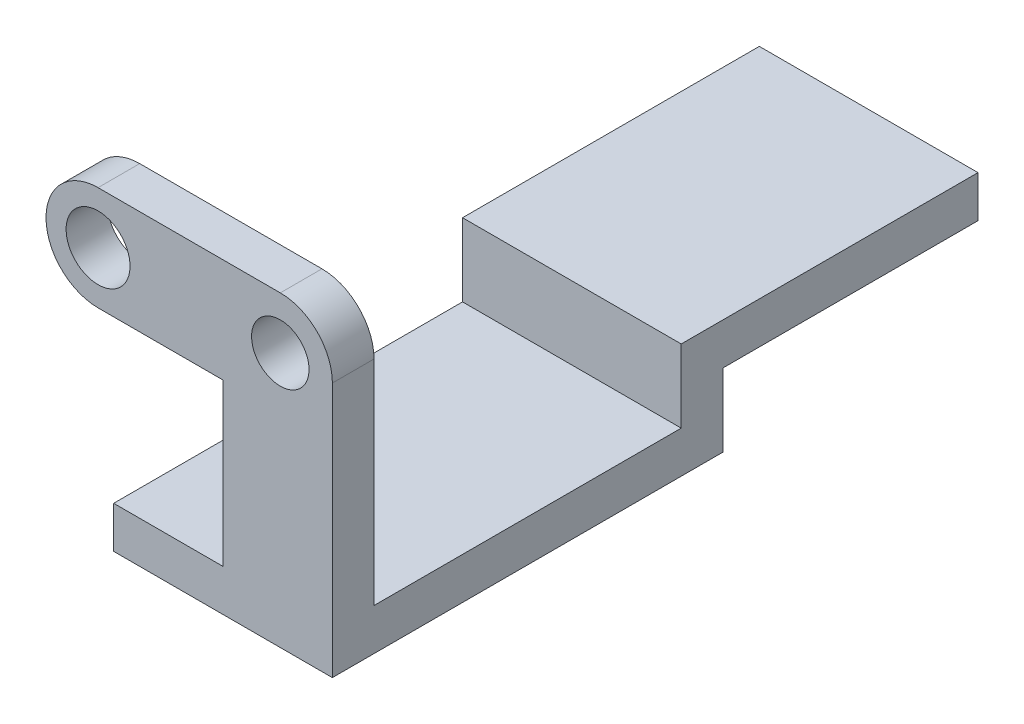
ISO-10303-21;
HEADER;
FILE_DESCRIPTION(('STEP AP214'),'2;1');
FILE_NAME('part.step','',(''),(''),'','','');
FILE_SCHEMA(('AUTOMOTIVE_DESIGN { 1 0 10303 214 1 1 1 1 }'));
ENDSEC;
DATA;
#1=APPLICATION_CONTEXT('core data for automotive mechanical design processes');
#2=APPLICATION_PROTOCOL_DEFINITION('international standard','automotive_design',2000,#1);
#3=PRODUCT_CONTEXT('',#1,'mechanical');
#4=PRODUCT('Part','Part','',(#3));
#5=PRODUCT_RELATED_PRODUCT_CATEGORY('part','',(#4));
#6=PRODUCT_DEFINITION_FORMATION('','',#4);
#7=PRODUCT_DEFINITION_CONTEXT('part definition',#1,'design');
#8=PRODUCT_DEFINITION('design','',#6,#7);
#9=PRODUCT_DEFINITION_SHAPE('','',#8);
#10=(LENGTH_UNIT() NAMED_UNIT(*) SI_UNIT(.MILLI.,.METRE.));
#11=(NAMED_UNIT(*) PLANE_ANGLE_UNIT() SI_UNIT($,.RADIAN.));
#12=(NAMED_UNIT(*) SI_UNIT($,.STERADIAN.) SOLID_ANGLE_UNIT());
#13=UNCERTAINTY_MEASURE_WITH_UNIT(LENGTH_MEASURE(1.E-05),#10,'distance_accuracy_value','');
#14=(GEOMETRIC_REPRESENTATION_CONTEXT(3) GLOBAL_UNCERTAINTY_ASSIGNED_CONTEXT((#13)) GLOBAL_UNIT_ASSIGNED_CONTEXT((#10,
#11,#12)) REPRESENTATION_CONTEXT('',''));
#15=CARTESIAN_POINT('',(0.,0.,0.));
#16=DIRECTION('',(0.,0.,1.));
#17=DIRECTION('',(1.,0.,0.));
#18=AXIS2_PLACEMENT_3D('',#15,#16,#17);
#19=CARTESIAN_POINT('',(42.,0.,0.));
#20=DIRECTION('',(0.,0.,1.));
#21=DIRECTION('',(1.,0.,0.));
#22=AXIS2_PLACEMENT_3D('',#19,#20,#21);
#23=PLANE('',#22);
#24=DIRECTION('',(0.,1.,0.));
#25=VECTOR('',#24,1.);
#26=CARTESIAN_POINT('',(-42.,0.,0.));
#27=LINE('',#26,#25);
#28=CARTESIAN_POINT('',(-42.,0.,0.));
#29=VERTEX_POINT('',#28);
#30=CARTESIAN_POINT('',(-42.,28.,0.));
#31=VERTEX_POINT('',#30);
#32=EDGE_CURVE('E149',#29,#31,#27,.T.);
#33=ORIENTED_EDGE('',*,*,#32,.T.);
#34=DIRECTION('',(-1.,0.,0.));
#35=VECTOR('',#34,1.);
#36=CARTESIAN_POINT('',(42.,28.,0.));
#37=LINE('',#36,#35);
#38=CARTESIAN_POINT('',(42.,28.,0.));
#39=VERTEX_POINT('',#38);
#40=EDGE_CURVE('E11',#39,#31,#37,.T.);
#41=ORIENTED_EDGE('',*,*,#40,.F.);
#42=DIRECTION('',(0.,1.,0.));
#43=VECTOR('',#42,1.);
#44=CARTESIAN_POINT('',(42.,0.,0.));
#45=LINE('',#44,#43);
#46=CARTESIAN_POINT('',(42.,0.,0.));
#47=VERTEX_POINT('',#46);
#48=EDGE_CURVE('E164',#47,#39,#45,.T.);
#49=ORIENTED_EDGE('',*,*,#48,.F.);
#50=DIRECTION('',(-1.,0.,0.));
#51=VECTOR('',#50,1.);
#52=CARTESIAN_POINT('',(42.,0.,0.));
#53=LINE('',#52,#51);
#54=EDGE_CURVE('E148',#47,#29,#53,.T.);
#55=ORIENTED_EDGE('',*,*,#54,.T.);
#56=EDGE_LOOP('',(#33,#41,#49,#55));
#57=FACE_BOUND('',#56,.T.);
#58=ADVANCED_FACE('F39',(#57),#23,.F.);
#59=CARTESIAN_POINT('',(42.,28.,0.));
#60=DIRECTION('',(0.,1.,0.));
#61=DIRECTION('',(0.,0.,1.));
#62=AXIS2_PLACEMENT_3D('',#59,#60,#61);
#63=PLANE('',#62);
#64=DIRECTION('',(0.,0.,-1.));
#65=VECTOR('',#64,1.);
#66=CARTESIAN_POINT('',(-42.,28.,0.));
#67=LINE('',#66,#65);
#68=CARTESIAN_POINT('',(-42.,28.,-98.));
#69=VERTEX_POINT('',#68);
#70=EDGE_CURVE('E152',#31,#69,#67,.T.);
#71=ORIENTED_EDGE('',*,*,#70,.T.);
#72=DIRECTION('',(-1.,0.,0.));
#73=VECTOR('',#72,1.);
#74=CARTESIAN_POINT('',(42.,28.,-98.));
#75=LINE('',#74,#73);
#76=CARTESIAN_POINT('',(42.,28.,-98.));
#77=VERTEX_POINT('',#76);
#78=EDGE_CURVE('E48',#77,#69,#75,.T.);
#79=ORIENTED_EDGE('',*,*,#78,.F.);
#80=DIRECTION('',(0.,0.,-1.));
#81=VECTOR('',#80,1.);
#82=CARTESIAN_POINT('',(42.,28.,0.));
#83=LINE('',#82,#81);
#84=EDGE_CURVE('E100',#39,#77,#83,.T.);
#85=ORIENTED_EDGE('',*,*,#84,.F.);
#86=ORIENTED_EDGE('',*,*,#40,.T.);
#87=EDGE_LOOP('',(#71,#79,#85,#86));
#88=FACE_BOUND('',#87,.T.);
#89=ADVANCED_FACE('F316',(#88),#63,.F.);
#90=CARTESIAN_POINT('',(42.,28.,-98.));
#91=DIRECTION('',(0.,0.,1.));
#92=DIRECTION('',(1.,0.,0.));
#93=AXIS2_PLACEMENT_3D('',#90,#91,#92);
#94=PLANE('',#93);
#95=DIRECTION('',(0.,1.,0.));
#96=VECTOR('',#95,1.);
#97=CARTESIAN_POINT('',(-42.,28.,-98.));
#98=LINE('',#97,#96);
#99=CARTESIAN_POINT('',(-42.,44.,-98.));
#100=VERTEX_POINT('',#99);
#101=EDGE_CURVE('E155',#69,#100,#98,.T.);
#102=ORIENTED_EDGE('',*,*,#101,.T.);
#103=DIRECTION('',(-1.,0.,0.));
#104=VECTOR('',#103,1.);
#105=CARTESIAN_POINT('',(42.,44.,-98.));
#106=LINE('',#105,#104);
#107=CARTESIAN_POINT('',(42.,44.,-98.));
#108=VERTEX_POINT('',#107);
#109=EDGE_CURVE('E170',#108,#100,#106,.T.);
#110=ORIENTED_EDGE('',*,*,#109,.F.);
#111=DIRECTION('',(0.,1.,0.));
#112=VECTOR('',#111,1.);
#113=CARTESIAN_POINT('',(42.,28.,-98.));
#114=LINE('',#113,#112);
#115=EDGE_CURVE('E241',#77,#108,#114,.T.);
#116=ORIENTED_EDGE('',*,*,#115,.F.);
#117=ORIENTED_EDGE('',*,*,#78,.T.);
#118=EDGE_LOOP('',(#102,#110,#116,#117));
#119=FACE_BOUND('',#118,.T.);
#120=ADVANCED_FACE('F245',(#119),#94,.F.);
#121=CARTESIAN_POINT('',(42.,44.,-98.));
#122=DIRECTION('',(0.,-1.,0.));
#123=DIRECTION('',(0.,0.,-1.));
#124=AXIS2_PLACEMENT_3D('',#121,#122,#123);
#125=PLANE('',#124);
#126=DIRECTION('',(0.,0.,1.));
#127=VECTOR('',#126,1.);
#128=CARTESIAN_POINT('',(-42.,44.,-98.));
#129=LINE('',#128,#127);
#130=CARTESIAN_POINT('',(-42.,44.,16.));
#131=VERTEX_POINT('',#130);
#132=EDGE_CURVE('E157',#100,#131,#129,.T.);
#133=ORIENTED_EDGE('',*,*,#132,.T.);
#134=DIRECTION('',(-1.,0.,0.));
#135=VECTOR('',#134,1.);
#136=CARTESIAN_POINT('',(42.,44.,16.));
#137=LINE('',#136,#135);
#138=CARTESIAN_POINT('',(42.,44.,16.));
#139=VERTEX_POINT('',#138);
#140=EDGE_CURVE('E134',#139,#131,#137,.T.);
#141=ORIENTED_EDGE('',*,*,#140,.F.);
#142=DIRECTION('',(0.,0.,1.));
#143=VECTOR('',#142,1.);
#144=CARTESIAN_POINT('',(42.,44.,-98.));
#145=LINE('',#144,#143);
#146=EDGE_CURVE('E121',#108,#139,#145,.T.);
#147=ORIENTED_EDGE('',*,*,#146,.F.);
#148=ORIENTED_EDGE('',*,*,#109,.T.);
#149=EDGE_LOOP('',(#133,#141,#147,#148));
#150=FACE_BOUND('',#149,.T.);
#151=ADVANCED_FACE('F249',(#150),#125,.F.);
#152=CARTESIAN_POINT('',(42.,44.,16.));
#153=DIRECTION('',(0.,0.,-1.));
#154=DIRECTION('',(0.,1.,0.));
#155=AXIS2_PLACEMENT_3D('',#152,#153,#154);
#156=PLANE('',#155);
#157=DIRECTION('',(0.,-1.,0.));
#158=VECTOR('',#157,1.);
#159=CARTESIAN_POINT('',(-42.,44.,16.));
#160=LINE('',#159,#158);
#161=CARTESIAN_POINT('',(-42.,16.,16.));
#162=VERTEX_POINT('',#161);
#163=EDGE_CURVE('E130',#131,#162,#160,.T.);
#164=ORIENTED_EDGE('',*,*,#163,.T.);
#165=DIRECTION('',(-1.,0.,0.));
#166=VECTOR('',#165,1.);
#167=CARTESIAN_POINT('',(42.,16.,16.));
#168=LINE('',#167,#166);
#169=CARTESIAN_POINT('',(42.,16.,16.));
#170=VERTEX_POINT('',#169);
#171=EDGE_CURVE('E127',#170,#162,#168,.T.);
#172=ORIENTED_EDGE('',*,*,#171,.F.);
#173=DIRECTION('',(0.,-1.,0.));
#174=VECTOR('',#173,1.);
#175=CARTESIAN_POINT('',(42.,44.,16.));
#176=LINE('',#175,#174);
#177=EDGE_CURVE('E114',#139,#170,#176,.T.);
#178=ORIENTED_EDGE('',*,*,#177,.F.);
#179=ORIENTED_EDGE('',*,*,#140,.T.);
#180=EDGE_LOOP('',(#164,#172,#178,#179));
#181=FACE_BOUND('',#180,.T.);
#182=ADVANCED_FACE('F128',(#181),#156,.F.);
#183=CARTESIAN_POINT('',(42.,16.,16.));
#184=DIRECTION('',(0.,-1.,0.));
#185=DIRECTION('',(0.,0.,-1.));
#186=AXIS2_PLACEMENT_3D('',#183,#184,#185);
#187=PLANE('',#186);
#188=DIRECTION('',(0.,0.,1.));
#189=VECTOR('',#188,1.);
#190=CARTESIAN_POINT('',(0.,16.,0.));
#191=LINE('',#190,#189);
#192=CARTESIAN_POINT('',(0.,16.,134.));
#193=VERTEX_POINT('',#192);
#194=CARTESIAN_POINT('',(0.,16.,150.));
#195=VERTEX_POINT('',#194);
#196=EDGE_CURVE('E228',#193,#195,#191,.T.);
#197=ORIENTED_EDGE('',*,*,#196,.F.);
#198=DIRECTION('',(1.,0.,0.));
#199=VECTOR('',#198,1.);
#200=CARTESIAN_POINT('',(0.,16.,134.));
#201=LINE('',#200,#199);
#202=CARTESIAN_POINT('',(42.,16.,134.));
#203=VERTEX_POINT('',#202);
#204=EDGE_CURVE('E141',#193,#203,#201,.T.);
#205=ORIENTED_EDGE('',*,*,#204,.T.);
#206=DIRECTION('',(0.,0.,1.));
#207=VECTOR('',#206,1.);
#208=CARTESIAN_POINT('',(42.,16.,16.));
#209=LINE('',#208,#207);
#210=EDGE_CURVE('E119',#170,#203,#209,.T.);
#211=ORIENTED_EDGE('',*,*,#210,.F.);
#212=ORIENTED_EDGE('',*,*,#171,.T.);
#213=DIRECTION('',(0.,0.,1.));
#214=VECTOR('',#213,1.);
#215=CARTESIAN_POINT('',(-42.,16.,16.));
#216=LINE('',#215,#214);
#217=CARTESIAN_POINT('',(-42.,16.,150.));
#218=VERTEX_POINT('',#217);
#219=EDGE_CURVE('E160',#162,#218,#216,.T.);
#220=ORIENTED_EDGE('',*,*,#219,.T.);
#221=DIRECTION('',(-1.,0.,0.));
#222=VECTOR('',#221,1.);
#223=CARTESIAN_POINT('',(42.,16.,150.));
#224=LINE('',#223,#222);
#225=EDGE_CURVE('E135',#195,#218,#224,.T.);
#226=ORIENTED_EDGE('',*,*,#225,.F.);
#227=EDGE_LOOP('',(#197,#205,#211,#212,#220,#226));
#228=FACE_BOUND('',#227,.T.);
#229=ADVANCED_FACE('F139',(#228),#187,.F.);
#230=CARTESIAN_POINT('',(42.,16.,150.));
#231=DIRECTION('',(0.,0.,-1.));
#232=DIRECTION('',(-1.,0.,0.));
#233=AXIS2_PLACEMENT_3D('',#230,#231,#232);
#234=PLANE('',#233);
#235=CARTESIAN_POINT('',(22.,98.,150.));
#236=DIRECTION('',(0.,0.,-1.));
#237=DIRECTION('',(0.,1.,0.));
#238=AXIS2_PLACEMENT_3D('',#235,#236,#237);
#239=CIRCLE('',#238,11.0343371601663);
#240=CARTESIAN_POINT('',(22.,109.034337160166,150.));
#241=VERTEX_POINT('',#240);
#242=EDGE_CURVE('E176',#241,#241,#239,.T.);
#243=ORIENTED_EDGE('',*,*,#242,.T.);
#244=EDGE_LOOP('',(#243));
#245=FACE_BOUND('',#244,.T.);
#246=CARTESIAN_POINT('',(-48.,98.,150.));
#247=DIRECTION('',(0.,0.,-1.));
#248=DIRECTION('',(0.,1.,0.));
#249=AXIS2_PLACEMENT_3D('',#246,#247,#248);
#250=CIRCLE('',#249,12.2801982153419);
#251=CARTESIAN_POINT('',(-48.,110.280198215342,150.));
#252=VERTEX_POINT('',#251);
#253=EDGE_CURVE('E182',#252,#252,#250,.T.);
#254=ORIENTED_EDGE('',*,*,#253,.T.);
#255=EDGE_LOOP('',(#254));
#256=FACE_BOUND('',#255,.T.);
#257=DIRECTION('',(1.,0.,0.));
#258=VECTOR('',#257,1.);
#259=CARTESIAN_POINT('',(0.,78.,150.));
#260=LINE('',#259,#258);
#261=CARTESIAN_POINT('',(-48.,78.,150.));
#262=VERTEX_POINT('',#261);
#263=CARTESIAN_POINT('',(0.,78.,150.));
#264=VERTEX_POINT('',#263);
#265=EDGE_CURVE('E189',#262,#264,#260,.T.);
#266=ORIENTED_EDGE('',*,*,#265,.T.);
#267=DIRECTION('',(0.,-1.,0.));
#268=VECTOR('',#267,1.);
#269=CARTESIAN_POINT('',(0.,98.,150.));
#270=LINE('',#269,#268);
#271=EDGE_CURVE('E234',#264,#195,#270,.T.);
#272=ORIENTED_EDGE('',*,*,#271,.T.);
#273=ORIENTED_EDGE('',*,*,#225,.T.);
#274=DIRECTION('',(0.,-1.,0.));
#275=VECTOR('',#274,1.);
#276=CARTESIAN_POINT('',(-42.,16.,150.));
#277=LINE('',#276,#275);
#278=CARTESIAN_POINT('',(-42.,0.,150.));
#279=VERTEX_POINT('',#278);
#280=EDGE_CURVE('E86',#218,#279,#277,.T.);
#281=ORIENTED_EDGE('',*,*,#280,.T.);
#282=DIRECTION('',(-1.,0.,0.));
#283=VECTOR('',#282,1.);
#284=CARTESIAN_POINT('',(42.,0.,150.));
#285=LINE('',#284,#283);
#286=CARTESIAN_POINT('',(42.,0.,150.));
#287=VERTEX_POINT('',#286);
#288=EDGE_CURVE('E166',#287,#279,#285,.T.);
#289=ORIENTED_EDGE('',*,*,#288,.F.);
#290=DIRECTION('',(0.,-1.,0.));
#291=VECTOR('',#290,1.);
#292=CARTESIAN_POINT('',(42.,16.,150.));
#293=LINE('',#292,#291);
#294=CARTESIAN_POINT('',(42.,98.,150.));
#295=VERTEX_POINT('',#294);
#296=EDGE_CURVE('E142',#295,#287,#293,.T.);
#297=ORIENTED_EDGE('',*,*,#296,.F.);
#298=CARTESIAN_POINT('',(22.,98.,150.));
#299=DIRECTION('',(0.,0.,1.));
#300=DIRECTION('',(1.,0.,0.));
#301=AXIS2_PLACEMENT_3D('',#298,#299,#300);
#302=CIRCLE('',#301,20.);
#303=CARTESIAN_POINT('',(22.,118.,150.));
#304=VERTEX_POINT('',#303);
#305=EDGE_CURVE('E196',#295,#304,#302,.T.);
#306=ORIENTED_EDGE('',*,*,#305,.T.);
#307=DIRECTION('',(1.,0.,0.));
#308=VECTOR('',#307,1.);
#309=CARTESIAN_POINT('',(0.,118.,150.));
#310=LINE('',#309,#308);
#311=CARTESIAN_POINT('',(-48.,118.,150.));
#312=VERTEX_POINT('',#311);
#313=EDGE_CURVE('E197',#312,#304,#310,.T.);
#314=ORIENTED_EDGE('',*,*,#313,.F.);
#315=CARTESIAN_POINT('',(-48.,98.,150.));
#316=DIRECTION('',(0.,0.,1.));
#317=DIRECTION('',(1.,0.,0.));
#318=AXIS2_PLACEMENT_3D('',#315,#316,#317);
#319=CIRCLE('',#318,20.);
#320=EDGE_CURVE('E193',#312,#262,#319,.T.);
#321=ORIENTED_EDGE('',*,*,#320,.T.);
#322=EDGE_LOOP('',(#266,#272,#273,#281,#289,#297,#306,#314,#321));
#323=FACE_BOUND('',#322,.T.);
#324=ADVANCED_FACE('F256',(#245,#256,#323),#234,.F.);
#325=CARTESIAN_POINT('',(42.,0.,150.));
#326=DIRECTION('',(0.,1.,0.));
#327=DIRECTION('',(0.,0.,1.));
#328=AXIS2_PLACEMENT_3D('',#325,#326,#327);
#329=PLANE('',#328);
#330=DIRECTION('',(0.,0.,-1.));
#331=VECTOR('',#330,1.);
#332=CARTESIAN_POINT('',(-42.,0.,150.));
#333=LINE('',#332,#331);
#334=EDGE_CURVE('E92',#279,#29,#333,.T.);
#335=ORIENTED_EDGE('',*,*,#334,.T.);
#336=ORIENTED_EDGE('',*,*,#54,.F.);
#337=DIRECTION('',(0.,0.,-1.));
#338=VECTOR('',#337,1.);
#339=CARTESIAN_POINT('',(42.,0.,150.));
#340=LINE('',#339,#338);
#341=EDGE_CURVE('E57',#287,#47,#340,.T.);
#342=ORIENTED_EDGE('',*,*,#341,.F.);
#343=ORIENTED_EDGE('',*,*,#288,.T.);
#344=EDGE_LOOP('',(#335,#336,#342,#343));
#345=FACE_BOUND('',#344,.T.);
#346=ADVANCED_FACE('F323',(#345),#329,.F.);
#347=CARTESIAN_POINT('',(42.,0.,0.));
#348=DIRECTION('',(-1.,0.,0.));
#349=DIRECTION('',(0.,0.,1.));
#350=AXIS2_PLACEMENT_3D('',#347,#348,#349);
#351=PLANE('',#350);
#352=ORIENTED_EDGE('',*,*,#48,.T.);
#353=ORIENTED_EDGE('',*,*,#84,.T.);
#354=ORIENTED_EDGE('',*,*,#115,.T.);
#355=ORIENTED_EDGE('',*,*,#146,.T.);
#356=ORIENTED_EDGE('',*,*,#177,.T.);
#357=ORIENTED_EDGE('',*,*,#210,.T.);
#358=DIRECTION('',(0.,-1.,0.));
#359=VECTOR('',#358,1.);
#360=CARTESIAN_POINT('',(42.,98.,134.));
#361=LINE('',#360,#359);
#362=CARTESIAN_POINT('',(42.,98.,134.));
#363=VERTEX_POINT('',#362);
#364=EDGE_CURVE('E227',#363,#203,#361,.T.);
#365=ORIENTED_EDGE('',*,*,#364,.F.);
#366=DIRECTION('',(0.,0.,-1.));
#367=VECTOR('',#366,1.);
#368=CARTESIAN_POINT('',(42.,98.,0.));
#369=LINE('',#368,#367);
#370=EDGE_CURVE('E224',#295,#363,#369,.T.);
#371=ORIENTED_EDGE('',*,*,#370,.F.);
#372=ORIENTED_EDGE('',*,*,#296,.T.);
#373=ORIENTED_EDGE('',*,*,#341,.T.);
#374=EDGE_LOOP('',(#352,#353,#354,#355,#356,#357,#365,#371,#372,#373));
#375=FACE_BOUND('',#374,.T.);
#376=ADVANCED_FACE('F116',(#375),#351,.F.);
#377=CARTESIAN_POINT('',(-42.,0.,0.));
#378=DIRECTION('',(-1.,0.,0.));
#379=DIRECTION('',(0.,0.,1.));
#380=AXIS2_PLACEMENT_3D('',#377,#378,#379);
#381=PLANE('',#380);
#382=ORIENTED_EDGE('',*,*,#32,.F.);
#383=ORIENTED_EDGE('',*,*,#334,.F.);
#384=ORIENTED_EDGE('',*,*,#280,.F.);
#385=ORIENTED_EDGE('',*,*,#219,.F.);
#386=ORIENTED_EDGE('',*,*,#163,.F.);
#387=ORIENTED_EDGE('',*,*,#132,.F.);
#388=ORIENTED_EDGE('',*,*,#101,.F.);
#389=ORIENTED_EDGE('',*,*,#70,.F.);
#390=EDGE_LOOP('',(#382,#383,#384,#385,#386,#387,#388,#389));
#391=FACE_BOUND('',#390,.T.);
#392=ADVANCED_FACE('F252',(#391),#381,.T.);
#393=CARTESIAN_POINT('',(0.,98.,134.));
#394=DIRECTION('',(0.,0.,-1.));
#395=DIRECTION('',(0.,1.,0.));
#396=AXIS2_PLACEMENT_3D('',#393,#394,#395);
#397=PLANE('',#396);
#398=CARTESIAN_POINT('',(22.,98.,134.));
#399=DIRECTION('',(0.,0.,-1.));
#400=DIRECTION('',(0.,1.,0.));
#401=AXIS2_PLACEMENT_3D('',#398,#399,#400);
#402=CIRCLE('',#401,11.0343371601663);
#403=CARTESIAN_POINT('',(22.,109.034337160166,134.));
#404=VERTEX_POINT('',#403);
#405=EDGE_CURVE('E42',#404,#404,#402,.T.);
#406=ORIENTED_EDGE('',*,*,#405,.F.);
#407=EDGE_LOOP('',(#406));
#408=FACE_BOUND('',#407,.T.);
#409=CARTESIAN_POINT('',(-48.,98.,134.));
#410=DIRECTION('',(0.,0.,-1.));
#411=DIRECTION('',(0.,1.,0.));
#412=AXIS2_PLACEMENT_3D('',#409,#410,#411);
#413=CIRCLE('',#412,12.2801982153419);
#414=CARTESIAN_POINT('',(-48.,110.280198215342,134.));
#415=VERTEX_POINT('',#414);
#416=EDGE_CURVE('E174',#415,#415,#413,.T.);
#417=ORIENTED_EDGE('',*,*,#416,.F.);
#418=EDGE_LOOP('',(#417));
#419=FACE_BOUND('',#418,.T.);
#420=DIRECTION('',(0.,-1.,0.));
#421=VECTOR('',#420,1.);
#422=CARTESIAN_POINT('',(0.,98.,134.));
#423=LINE('',#422,#421);
#424=CARTESIAN_POINT('',(0.,78.,134.));
#425=VERTEX_POINT('',#424);
#426=EDGE_CURVE('E153',#425,#193,#423,.T.);
#427=ORIENTED_EDGE('',*,*,#426,.F.);
#428=DIRECTION('',(1.,0.,0.));
#429=VECTOR('',#428,1.);
#430=CARTESIAN_POINT('',(0.,78.,134.));
#431=LINE('',#430,#429);
#432=CARTESIAN_POINT('',(-48.,78.,134.));
#433=VERTEX_POINT('',#432);
#434=EDGE_CURVE('E180',#433,#425,#431,.T.);
#435=ORIENTED_EDGE('',*,*,#434,.F.);
#436=CARTESIAN_POINT('',(-48.,98.,134.));
#437=DIRECTION('',(0.,0.,-1.));
#438=DIRECTION('',(0.,1.,0.));
#439=AXIS2_PLACEMENT_3D('',#436,#437,#438);
#440=CIRCLE('',#439,20.);
#441=CARTESIAN_POINT('',(-48.,118.,134.));
#442=VERTEX_POINT('',#441);
#443=EDGE_CURVE('E209',#442,#433,#440,.F.);
#444=ORIENTED_EDGE('',*,*,#443,.F.);
#445=DIRECTION('',(1.,0.,0.));
#446=VECTOR('',#445,1.);
#447=CARTESIAN_POINT('',(0.,118.,134.));
#448=LINE('',#447,#446);
#449=CARTESIAN_POINT('',(22.,118.,134.));
#450=VERTEX_POINT('',#449);
#451=EDGE_CURVE('E192',#442,#450,#448,.T.);
#452=ORIENTED_EDGE('',*,*,#451,.T.);
#453=CARTESIAN_POINT('',(22.,98.,134.));
#454=DIRECTION('',(0.,0.,-1.));
#455=DIRECTION('',(0.,1.,0.));
#456=AXIS2_PLACEMENT_3D('',#453,#454,#455);
#457=CIRCLE('',#456,20.);
#458=EDGE_CURVE('E200',#363,#450,#457,.F.);
#459=ORIENTED_EDGE('',*,*,#458,.F.);
#460=ORIENTED_EDGE('',*,*,#364,.T.);
#461=ORIENTED_EDGE('',*,*,#204,.F.);
#462=EDGE_LOOP('',(#427,#435,#444,#452,#459,#460,#461));
#463=FACE_BOUND('',#462,.T.);
#464=ADVANCED_FACE('F269',(#408,#419,#463),#397,.T.);
#465=CARTESIAN_POINT('',(0.,98.,0.));
#466=DIRECTION('',(1.,0.,0.));
#467=DIRECTION('',(0.,0.,-1.));
#468=AXIS2_PLACEMENT_3D('',#465,#466,#467);
#469=PLANE('',#468);
#470=ORIENTED_EDGE('',*,*,#271,.F.);
#471=DIRECTION('',(0.,0.,1.));
#472=VECTOR('',#471,1.);
#473=CARTESIAN_POINT('',(0.,78.,16.9530008928038));
#474=LINE('',#473,#472);
#475=EDGE_CURVE('E213',#425,#264,#474,.T.);
#476=ORIENTED_EDGE('',*,*,#475,.F.);
#477=ORIENTED_EDGE('',*,*,#426,.T.);
#478=ORIENTED_EDGE('',*,*,#196,.T.);
#479=EDGE_LOOP('',(#470,#476,#477,#478));
#480=FACE_BOUND('',#479,.T.);
#481=ADVANCED_FACE('F262',(#480),#469,.F.);
#482=CARTESIAN_POINT('',(0.,78.,16.9530008928038));
#483=DIRECTION('',(0.,-1.,0.));
#484=DIRECTION('',(0.,0.,-1.));
#485=AXIS2_PLACEMENT_3D('',#482,#483,#484);
#486=PLANE('',#485);
#487=DIRECTION('',(0.,0.,1.));
#488=VECTOR('',#487,1.);
#489=CARTESIAN_POINT('',(-48.,78.,16.9530008928038));
#490=LINE('',#489,#488);
#491=EDGE_CURVE('E212',#433,#262,#490,.T.);
#492=ORIENTED_EDGE('',*,*,#491,.F.);
#493=ORIENTED_EDGE('',*,*,#434,.T.);
#494=ORIENTED_EDGE('',*,*,#475,.T.);
#495=ORIENTED_EDGE('',*,*,#265,.F.);
#496=EDGE_LOOP('',(#492,#493,#494,#495));
#497=FACE_BOUND('',#496,.T.);
#498=ADVANCED_FACE('F292',(#497),#486,.T.);
#499=CARTESIAN_POINT('',(-48.,98.,16.9530008928038));
#500=DIRECTION('',(0.,0.,1.));
#501=DIRECTION('',(1.,0.,0.));
#502=AXIS2_PLACEMENT_3D('',#499,#500,#501);
#503=CYLINDRICAL_SURFACE('',#502,20.);
#504=DIRECTION('',(0.,0.,1.));
#505=VECTOR('',#504,1.);
#506=CARTESIAN_POINT('',(-48.,118.,16.9530008928038));
#507=LINE('',#506,#505);
#508=EDGE_CURVE('E201',#442,#312,#507,.T.);
#509=ORIENTED_EDGE('',*,*,#508,.F.);
#510=ORIENTED_EDGE('',*,*,#443,.T.);
#511=ORIENTED_EDGE('',*,*,#491,.T.);
#512=ORIENTED_EDGE('',*,*,#320,.F.);
#513=EDGE_LOOP('',(#509,#510,#511,#512));
#514=FACE_BOUND('',#513,.T.);
#515=ADVANCED_FACE('F296',(#514),#503,.T.);
#516=CARTESIAN_POINT('',(0.,118.,16.9530008928038));
#517=DIRECTION('',(0.,-1.,0.));
#518=DIRECTION('',(1.,0.,0.));
#519=AXIS2_PLACEMENT_3D('',#516,#517,#518);
#520=PLANE('',#519);
#521=ORIENTED_EDGE('',*,*,#451,.F.);
#522=ORIENTED_EDGE('',*,*,#508,.T.);
#523=ORIENTED_EDGE('',*,*,#313,.T.);
#524=DIRECTION('',(0.,0.,1.));
#525=VECTOR('',#524,1.);
#526=CARTESIAN_POINT('',(22.,118.,16.9530008928038));
#527=LINE('',#526,#525);
#528=EDGE_CURVE('E204',#450,#304,#527,.T.);
#529=ORIENTED_EDGE('',*,*,#528,.F.);
#530=EDGE_LOOP('',(#521,#522,#523,#529));
#531=FACE_BOUND('',#530,.T.);
#532=ADVANCED_FACE('F300',(#531),#520,.F.);
#533=CARTESIAN_POINT('',(22.,98.,16.9530008928038));
#534=DIRECTION('',(0.,0.,1.));
#535=DIRECTION('',(1.,0.,0.));
#536=AXIS2_PLACEMENT_3D('',#533,#534,#535);
#537=CYLINDRICAL_SURFACE('',#536,20.);
#538=ORIENTED_EDGE('',*,*,#370,.T.);
#539=ORIENTED_EDGE('',*,*,#458,.T.);
#540=ORIENTED_EDGE('',*,*,#528,.T.);
#541=ORIENTED_EDGE('',*,*,#305,.F.);
#542=EDGE_LOOP('',(#538,#539,#540,#541));
#543=FACE_BOUND('',#542,.T.);
#544=ADVANCED_FACE('F304',(#543),#537,.T.);
#545=CARTESIAN_POINT('',(-48.,98.,150.));
#546=DIRECTION('',(0.,0.,-1.));
#547=DIRECTION('',(0.,1.,0.));
#548=AXIS2_PLACEMENT_3D('',#545,#546,#547);
#549=CYLINDRICAL_SURFACE('',#548,12.2801982153419);
#550=ORIENTED_EDGE('',*,*,#416,.T.);
#551=EDGE_LOOP('',(#550));
#552=FACE_BOUND('',#551,.T.);
#553=ORIENTED_EDGE('',*,*,#253,.F.);
#554=EDGE_LOOP('',(#553));
#555=FACE_BOUND('',#554,.T.);
#556=ADVANCED_FACE('F306',(#552,#555),#549,.F.);
#557=CARTESIAN_POINT('',(22.,98.,150.));
#558=DIRECTION('',(0.,0.,-1.));
#559=DIRECTION('',(0.,1.,0.));
#560=AXIS2_PLACEMENT_3D('',#557,#558,#559);
#561=CYLINDRICAL_SURFACE('',#560,11.0343371601663);
#562=ORIENTED_EDGE('',*,*,#405,.T.);
#563=EDGE_LOOP('',(#562));
#564=FACE_BOUND('',#563,.T.);
#565=ORIENTED_EDGE('',*,*,#242,.F.);
#566=EDGE_LOOP('',(#565));
#567=FACE_BOUND('',#566,.T.);
#568=ADVANCED_FACE('F312',(#564,#567),#561,.F.);
#569=CLOSED_SHELL('',(#58,#89,#120,#151,#182,#229,#324,#346,#376,#392,#464,#481,#498,#515,#532,
#544,#556,#568));
#570=MANIFOLD_SOLID_BREP('B2',#569);
#571=ADVANCED_BREP_SHAPE_REPRESENTATION('',(#18,#570),#14);
#572=SHAPE_DEFINITION_REPRESENTATION(#9,#571);
ENDSEC;
END-ISO-10303-21;
